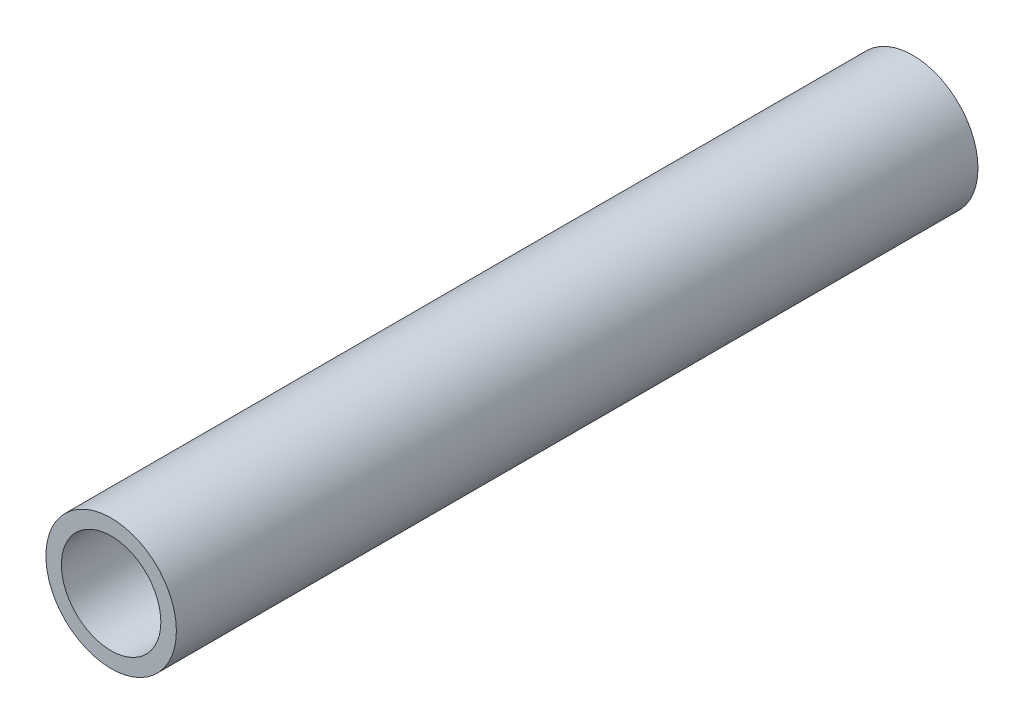
ISO-10303-21;
HEADER;
FILE_DESCRIPTION(('STEP AP214'),'2;1');
FILE_NAME('part.step','',(''),(''),'','','');
FILE_SCHEMA(('AUTOMOTIVE_DESIGN { 1 0 10303 214 1 1 1 1 }'));
ENDSEC;
DATA;
#1=APPLICATION_CONTEXT('core data for automotive mechanical design processes');
#2=APPLICATION_PROTOCOL_DEFINITION('international standard','automotive_design',2000,#1);
#3=PRODUCT_CONTEXT('',#1,'mechanical');
#4=PRODUCT('Part','Part','',(#3));
#5=PRODUCT_RELATED_PRODUCT_CATEGORY('part','',(#4));
#6=PRODUCT_DEFINITION_FORMATION('','',#4);
#7=PRODUCT_DEFINITION_CONTEXT('part definition',#1,'design');
#8=PRODUCT_DEFINITION('design','',#6,#7);
#9=PRODUCT_DEFINITION_SHAPE('','',#8);
#10=(LENGTH_UNIT() NAMED_UNIT(*) SI_UNIT(.MILLI.,.METRE.));
#11=(NAMED_UNIT(*) PLANE_ANGLE_UNIT() SI_UNIT($,.RADIAN.));
#12=(NAMED_UNIT(*) SI_UNIT($,.STERADIAN.) SOLID_ANGLE_UNIT());
#13=UNCERTAINTY_MEASURE_WITH_UNIT(LENGTH_MEASURE(1.E-05),#10,'distance_accuracy_value','');
#14=(GEOMETRIC_REPRESENTATION_CONTEXT(3) GLOBAL_UNCERTAINTY_ASSIGNED_CONTEXT((#13)) GLOBAL_UNIT_ASSIGNED_CONTEXT((#10,
#11,#12)) REPRESENTATION_CONTEXT('',''));
#15=CARTESIAN_POINT('',(0.,0.,0.));
#16=DIRECTION('',(0.,0.,1.));
#17=DIRECTION('',(1.,0.,0.));
#18=AXIS2_PLACEMENT_3D('',#15,#16,#17);
#19=CARTESIAN_POINT('',(0.,0.,32.25));
#20=DIRECTION('',(0.,0.,1.));
#21=DIRECTION('',(1.,0.,0.));
#22=AXIS2_PLACEMENT_3D('',#19,#20,#21);
#23=PLANE('',#22);
#24=CARTESIAN_POINT('',(0.,0.,32.25));
#25=DIRECTION('',(0.,0.,1.));
#26=DIRECTION('',(1.,0.,0.));
#27=AXIS2_PLACEMENT_3D('',#24,#25,#26);
#28=CIRCLE('',#27,5.25);
#29=CARTESIAN_POINT('',(5.25,0.,32.25));
#30=VERTEX_POINT('',#29);
#31=EDGE_CURVE('E10',#30,#30,#28,.T.);
#32=ORIENTED_EDGE('',*,*,#31,.T.);
#33=EDGE_LOOP('',(#32));
#34=FACE_BOUND('',#33,.T.);
#35=CARTESIAN_POINT('',(0.,0.,32.25));
#36=DIRECTION('',(0.,0.,1.));
#37=DIRECTION('',(1.,0.,0.));
#38=AXIS2_PLACEMENT_3D('',#35,#36,#37);
#39=CIRCLE('',#38,4.);
#40=CARTESIAN_POINT('',(4.,0.,32.25));
#41=VERTEX_POINT('',#40);
#42=EDGE_CURVE('E43',#41,#41,#39,.T.);
#43=ORIENTED_EDGE('',*,*,#42,.F.);
#44=EDGE_LOOP('',(#43));
#45=FACE_BOUND('',#44,.T.);
#46=ADVANCED_FACE('F32',(#34,#45),#23,.T.);
#47=CARTESIAN_POINT('',(0.,0.,-32.25));
#48=DIRECTION('',(0.,0.,1.));
#49=DIRECTION('',(1.,0.,0.));
#50=AXIS2_PLACEMENT_3D('',#47,#48,#49);
#51=PLANE('',#50);
#52=CARTESIAN_POINT('',(0.,0.,-32.25));
#53=DIRECTION('',(0.,0.,1.));
#54=DIRECTION('',(1.,0.,0.));
#55=AXIS2_PLACEMENT_3D('',#52,#53,#54);
#56=CIRCLE('',#55,5.25);
#57=CARTESIAN_POINT('',(5.25,0.,-32.25));
#58=VERTEX_POINT('',#57);
#59=EDGE_CURVE('E36',#58,#58,#56,.T.);
#60=ORIENTED_EDGE('',*,*,#59,.F.);
#61=EDGE_LOOP('',(#60));
#62=FACE_BOUND('',#61,.T.);
#63=CARTESIAN_POINT('',(0.,0.,-32.25));
#64=DIRECTION('',(0.,0.,1.));
#65=DIRECTION('',(1.,0.,0.));
#66=AXIS2_PLACEMENT_3D('',#63,#64,#65);
#67=CIRCLE('',#66,4.);
#68=CARTESIAN_POINT('',(4.,0.,-32.25));
#69=VERTEX_POINT('',#68);
#70=EDGE_CURVE('E45',#69,#69,#67,.T.);
#71=ORIENTED_EDGE('',*,*,#70,.T.);
#72=EDGE_LOOP('',(#71));
#73=FACE_BOUND('',#72,.T.);
#74=ADVANCED_FACE('F55',(#62,#73),#51,.F.);
#75=CARTESIAN_POINT('',(0.,0.,32.25));
#76=DIRECTION('',(0.,0.,-1.));
#77=DIRECTION('',(-1.,0.,0.));
#78=AXIS2_PLACEMENT_3D('',#75,#76,#77);
#79=CYLINDRICAL_SURFACE('',#78,5.25);
#80=ORIENTED_EDGE('',*,*,#31,.F.);
#81=EDGE_LOOP('',(#80));
#82=FACE_BOUND('',#81,.T.);
#83=ORIENTED_EDGE('',*,*,#59,.T.);
#84=EDGE_LOOP('',(#83));
#85=FACE_BOUND('',#84,.T.);
#86=ADVANCED_FACE('F34',(#82,#85),#79,.T.);
#87=CARTESIAN_POINT('',(0.,0.,32.25));
#88=DIRECTION('',(0.,0.,-1.));
#89=DIRECTION('',(-1.,0.,0.));
#90=AXIS2_PLACEMENT_3D('',#87,#88,#89);
#91=CYLINDRICAL_SURFACE('',#90,4.);
#92=ORIENTED_EDGE('',*,*,#42,.T.);
#93=EDGE_LOOP('',(#92));
#94=FACE_BOUND('',#93,.T.);
#95=ORIENTED_EDGE('',*,*,#70,.F.);
#96=EDGE_LOOP('',(#95));
#97=FACE_BOUND('',#96,.T.);
#98=ADVANCED_FACE('F51',(#94,#97),#91,.F.);
#99=CLOSED_SHELL('',(#46,#74,#86,#98));
#100=MANIFOLD_SOLID_BREP('B2',#99);
#101=ADVANCED_BREP_SHAPE_REPRESENTATION('',(#18,#100),#14);
#102=SHAPE_DEFINITION_REPRESENTATION(#9,#101);
ENDSEC;
END-ISO-10303-21;
